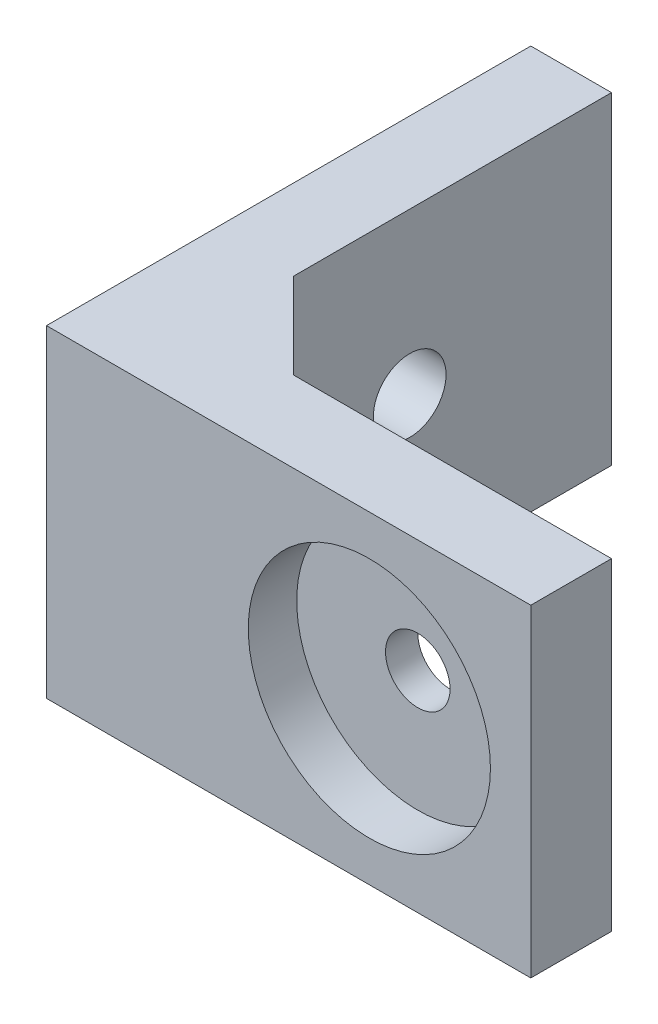
ISO-10303-21;
HEADER;
FILE_DESCRIPTION(('STEP AP214'),'2;1');
FILE_NAME('part.step','',(''),(''),'','','');
FILE_SCHEMA(('AUTOMOTIVE_DESIGN { 1 0 10303 214 1 1 1 1 }'));
ENDSEC;
DATA;
#1=APPLICATION_CONTEXT('core data for automotive mechanical design processes');
#2=APPLICATION_PROTOCOL_DEFINITION('international standard','automotive_design',2000,#1);
#3=PRODUCT_CONTEXT('',#1,'mechanical');
#4=PRODUCT('Part','Part','',(#3));
#5=PRODUCT_RELATED_PRODUCT_CATEGORY('part','',(#4));
#6=PRODUCT_DEFINITION_FORMATION('','',#4);
#7=PRODUCT_DEFINITION_CONTEXT('part definition',#1,'design');
#8=PRODUCT_DEFINITION('design','',#6,#7);
#9=PRODUCT_DEFINITION_SHAPE('','',#8);
#10=(LENGTH_UNIT() NAMED_UNIT(*) SI_UNIT(.MILLI.,.METRE.));
#11=(NAMED_UNIT(*) PLANE_ANGLE_UNIT() SI_UNIT($,.RADIAN.));
#12=(NAMED_UNIT(*) SI_UNIT($,.STERADIAN.) SOLID_ANGLE_UNIT());
#13=UNCERTAINTY_MEASURE_WITH_UNIT(LENGTH_MEASURE(1.E-05),#10,'distance_accuracy_value','');
#14=(GEOMETRIC_REPRESENTATION_CONTEXT(3) GLOBAL_UNCERTAINTY_ASSIGNED_CONTEXT((#13)) GLOBAL_UNIT_ASSIGNED_CONTEXT((#10,
#11,#12)) REPRESENTATION_CONTEXT('',''));
#15=CARTESIAN_POINT('',(0.,0.,0.));
#16=DIRECTION('',(0.,0.,1.));
#17=DIRECTION('',(1.,0.,0.));
#18=AXIS2_PLACEMENT_3D('',#15,#16,#17);
#19=CARTESIAN_POINT('',(0.,20.,-30.));
#20=DIRECTION('',(0.,0.,1.));
#21=DIRECTION('',(1.,0.,0.));
#22=AXIS2_PLACEMENT_3D('',#19,#20,#21);
#23=PLANE('',#22);
#24=DIRECTION('',(-1.,0.,0.));
#25=VECTOR('',#24,1.);
#26=CARTESIAN_POINT('',(0.,0.,-30.));
#27=LINE('',#26,#25);
#28=CARTESIAN_POINT('',(5.,0.,-30.));
#29=VERTEX_POINT('',#28);
#30=CARTESIAN_POINT('',(0.,0.,-30.));
#31=VERTEX_POINT('',#30);
#32=EDGE_CURVE('E128',#29,#31,#27,.T.);
#33=ORIENTED_EDGE('',*,*,#32,.T.);
#34=DIRECTION('',(0.,-1.,0.));
#35=VECTOR('',#34,1.);
#36=CARTESIAN_POINT('',(0.,20.,-30.));
#37=LINE('',#36,#35);
#38=CARTESIAN_POINT('',(0.,20.,-30.));
#39=VERTEX_POINT('',#38);
#40=EDGE_CURVE('E11',#39,#31,#37,.T.);
#41=ORIENTED_EDGE('',*,*,#40,.F.);
#42=DIRECTION('',(-1.,0.,0.));
#43=VECTOR('',#42,1.);
#44=CARTESIAN_POINT('',(0.,20.,-30.));
#45=LINE('',#44,#43);
#46=CARTESIAN_POINT('',(5.,20.,-30.));
#47=VERTEX_POINT('',#46);
#48=EDGE_CURVE('E141',#47,#39,#45,.T.);
#49=ORIENTED_EDGE('',*,*,#48,.F.);
#50=DIRECTION('',(0.,-1.,0.));
#51=VECTOR('',#50,1.);
#52=CARTESIAN_POINT('',(5.,20.,-30.));
#53=LINE('',#52,#51);
#54=EDGE_CURVE('E124',#47,#29,#53,.T.);
#55=ORIENTED_EDGE('',*,*,#54,.T.);
#56=EDGE_LOOP('',(#33,#41,#49,#55));
#57=FACE_BOUND('',#56,.T.);
#58=ADVANCED_FACE('F37',(#57),#23,.F.);
#59=CARTESIAN_POINT('',(0.,20.,0.));
#60=DIRECTION('',(1.,0.,0.));
#61=DIRECTION('',(0.,0.,-1.));
#62=AXIS2_PLACEMENT_3D('',#59,#60,#61);
#63=PLANE('',#62);
#64=CARTESIAN_POINT('',(0.,10.,-17.5));
#65=DIRECTION('',(1.,0.,0.));
#66=DIRECTION('',(0.,0.,-1.));
#67=AXIS2_PLACEMENT_3D('',#64,#65,#66);
#68=CIRCLE('',#67,2.24999999999999);
#69=CARTESIAN_POINT('',(0.,10.,-19.75));
#70=VERTEX_POINT('',#69);
#71=EDGE_CURVE('E132',#70,#70,#68,.T.);
#72=ORIENTED_EDGE('',*,*,#71,.T.);
#73=EDGE_LOOP('',(#72));
#74=FACE_BOUND('',#73,.T.);
#75=DIRECTION('',(0.,0.,1.));
#76=VECTOR('',#75,1.);
#77=CARTESIAN_POINT('',(0.,0.,0.));
#78=LINE('',#77,#76);
#79=CARTESIAN_POINT('',(0.,0.,0.));
#80=VERTEX_POINT('',#79);
#81=EDGE_CURVE('E131',#31,#80,#78,.T.);
#82=ORIENTED_EDGE('',*,*,#81,.T.);
#83=DIRECTION('',(0.,-1.,0.));
#84=VECTOR('',#83,1.);
#85=CARTESIAN_POINT('',(0.,20.,0.));
#86=LINE('',#85,#84);
#87=CARTESIAN_POINT('',(0.,20.,0.));
#88=VERTEX_POINT('',#87);
#89=EDGE_CURVE('E46',#88,#80,#86,.T.);
#90=ORIENTED_EDGE('',*,*,#89,.F.);
#91=DIRECTION('',(0.,0.,1.));
#92=VECTOR('',#91,1.);
#93=CARTESIAN_POINT('',(0.,20.,0.));
#94=LINE('',#93,#92);
#95=EDGE_CURVE('E94',#39,#88,#94,.T.);
#96=ORIENTED_EDGE('',*,*,#95,.F.);
#97=ORIENTED_EDGE('',*,*,#40,.T.);
#98=EDGE_LOOP('',(#82,#90,#96,#97));
#99=FACE_BOUND('',#98,.T.);
#100=ADVANCED_FACE('F200',(#74,#99),#63,.F.);
#101=CARTESIAN_POINT('',(30.,20.,0.));
#102=DIRECTION('',(0.,0.,-1.));
#103=DIRECTION('',(-1.,0.,0.));
#104=AXIS2_PLACEMENT_3D('',#101,#102,#103);
#105=PLANE('',#104);
#106=CARTESIAN_POINT('',(20.,10.,0.));
#107=DIRECTION('',(0.,0.,1.));
#108=DIRECTION('',(1.,0.,0.));
#109=AXIS2_PLACEMENT_3D('',#106,#107,#108);
#110=CIRCLE('',#109,7.5);
#111=CARTESIAN_POINT('',(27.5,10.,0.));
#112=VERTEX_POINT('',#111);
#113=EDGE_CURVE('E171',#112,#112,#110,.T.);
#114=ORIENTED_EDGE('',*,*,#113,.F.);
#115=EDGE_LOOP('',(#114));
#116=FACE_BOUND('',#115,.T.);
#117=DIRECTION('',(1.,0.,0.));
#118=VECTOR('',#117,1.);
#119=CARTESIAN_POINT('',(30.,0.,0.));
#120=LINE('',#119,#118);
#121=CARTESIAN_POINT('',(30.,0.,0.));
#122=VERTEX_POINT('',#121);
#123=EDGE_CURVE('E134',#80,#122,#120,.T.);
#124=ORIENTED_EDGE('',*,*,#123,.T.);
#125=DIRECTION('',(0.,-1.,0.));
#126=VECTOR('',#125,1.);
#127=CARTESIAN_POINT('',(30.,20.,0.));
#128=LINE('',#127,#126);
#129=CARTESIAN_POINT('',(30.,20.,0.));
#130=VERTEX_POINT('',#129);
#131=EDGE_CURVE('E145',#130,#122,#128,.T.);
#132=ORIENTED_EDGE('',*,*,#131,.F.);
#133=DIRECTION('',(1.,0.,0.));
#134=VECTOR('',#133,1.);
#135=CARTESIAN_POINT('',(30.,20.,0.));
#136=LINE('',#135,#134);
#137=EDGE_CURVE('E154',#88,#130,#136,.T.);
#138=ORIENTED_EDGE('',*,*,#137,.F.);
#139=ORIENTED_EDGE('',*,*,#89,.T.);
#140=EDGE_LOOP('',(#124,#132,#138,#139));
#141=FACE_BOUND('',#140,.T.);
#142=ADVANCED_FACE('F152',(#116,#141),#105,.F.);
#143=CARTESIAN_POINT('',(30.,20.,-5.));
#144=DIRECTION('',(-1.,0.,0.));
#145=DIRECTION('',(0.,0.,1.));
#146=AXIS2_PLACEMENT_3D('',#143,#144,#145);
#147=PLANE('',#146);
#148=DIRECTION('',(0.,0.,-1.));
#149=VECTOR('',#148,1.);
#150=CARTESIAN_POINT('',(30.,0.,-5.));
#151=LINE('',#150,#149);
#152=CARTESIAN_POINT('',(30.,0.,-5.));
#153=VERTEX_POINT('',#152);
#154=EDGE_CURVE('E136',#122,#153,#151,.T.);
#155=ORIENTED_EDGE('',*,*,#154,.T.);
#156=DIRECTION('',(0.,-1.,0.));
#157=VECTOR('',#156,1.);
#158=CARTESIAN_POINT('',(30.,20.,-5.));
#159=LINE('',#158,#157);
#160=CARTESIAN_POINT('',(30.,20.,-5.));
#161=VERTEX_POINT('',#160);
#162=EDGE_CURVE('E119',#161,#153,#159,.T.);
#163=ORIENTED_EDGE('',*,*,#162,.F.);
#164=DIRECTION('',(0.,0.,-1.));
#165=VECTOR('',#164,1.);
#166=CARTESIAN_POINT('',(30.,20.,-5.));
#167=LINE('',#166,#165);
#168=EDGE_CURVE('E110',#130,#161,#167,.T.);
#169=ORIENTED_EDGE('',*,*,#168,.F.);
#170=ORIENTED_EDGE('',*,*,#131,.T.);
#171=EDGE_LOOP('',(#155,#163,#169,#170));
#172=FACE_BOUND('',#171,.T.);
#173=ADVANCED_FACE('F160',(#172),#147,.F.);
#174=CARTESIAN_POINT('',(10.3033008588991,20.,-5.));
#175=DIRECTION('',(0.,0.,1.));
#176=DIRECTION('',(1.,0.,0.));
#177=AXIS2_PLACEMENT_3D('',#174,#175,#176);
#178=PLANE('',#177);
#179=CARTESIAN_POINT('',(20.,10.,-5.));
#180=DIRECTION('',(0.,0.,1.));
#181=DIRECTION('',(1.,0.,0.));
#182=AXIS2_PLACEMENT_3D('',#179,#180,#181);
#183=CIRCLE('',#182,2.);
#184=CARTESIAN_POINT('',(22.,10.,-5.));
#185=VERTEX_POINT('',#184);
#186=EDGE_CURVE('E174',#185,#185,#183,.T.);
#187=ORIENTED_EDGE('',*,*,#186,.T.);
#188=EDGE_LOOP('',(#187));
#189=FACE_BOUND('',#188,.T.);
#190=DIRECTION('',(-1.,0.,0.));
#191=VECTOR('',#190,1.);
#192=CARTESIAN_POINT('',(10.3033008588991,0.,-5.));
#193=LINE('',#192,#191);
#194=CARTESIAN_POINT('',(10.3033008588991,0.,-5.));
#195=VERTEX_POINT('',#194);
#196=EDGE_CURVE('E118',#153,#195,#193,.T.);
#197=ORIENTED_EDGE('',*,*,#196,.T.);
#198=DIRECTION('',(0.,-1.,0.));
#199=VECTOR('',#198,1.);
#200=CARTESIAN_POINT('',(10.3033008588991,20.,-5.));
#201=LINE('',#200,#199);
#202=CARTESIAN_POINT('',(10.3033008588991,20.,-5.));
#203=VERTEX_POINT('',#202);
#204=EDGE_CURVE('E115',#203,#195,#201,.T.);
#205=ORIENTED_EDGE('',*,*,#204,.F.);
#206=DIRECTION('',(-1.,0.,0.));
#207=VECTOR('',#206,1.);
#208=CARTESIAN_POINT('',(10.3033008588991,20.,-5.));
#209=LINE('',#208,#207);
#210=EDGE_CURVE('E104',#161,#203,#209,.T.);
#211=ORIENTED_EDGE('',*,*,#210,.F.);
#212=ORIENTED_EDGE('',*,*,#162,.T.);
#213=EDGE_LOOP('',(#197,#205,#211,#212));
#214=FACE_BOUND('',#213,.T.);
#215=ADVANCED_FACE('F116',(#189,#214),#178,.F.);
#216=CARTESIAN_POINT('',(5.,20.,-10.3033008588991));
#217=DIRECTION('',(-0.707106781186548,0.,0.707106781186548));
#218=DIRECTION('',(0.707106781186548,0.,0.707106781186548));
#219=AXIS2_PLACEMENT_3D('',#216,#217,#218);
#220=PLANE('',#219);
#221=DIRECTION('',(-0.707106781186548,0.,-0.707106781186548));
#222=VECTOR('',#221,1.);
#223=CARTESIAN_POINT('',(5.,0.,-10.3033008588991));
#224=LINE('',#223,#222);
#225=CARTESIAN_POINT('',(5.,0.,-10.3033008588991));
#226=VERTEX_POINT('',#225);
#227=EDGE_CURVE('E80',#195,#226,#224,.T.);
#228=ORIENTED_EDGE('',*,*,#227,.T.);
#229=DIRECTION('',(0.,-1.,0.));
#230=VECTOR('',#229,1.);
#231=CARTESIAN_POINT('',(5.,20.,-10.3033008588991));
#232=LINE('',#231,#230);
#233=CARTESIAN_POINT('',(5.,20.,-10.3033008588991));
#234=VERTEX_POINT('',#233);
#235=EDGE_CURVE('E120',#234,#226,#232,.T.);
#236=ORIENTED_EDGE('',*,*,#235,.F.);
#237=DIRECTION('',(-0.707106781186548,0.,-0.707106781186548));
#238=VECTOR('',#237,1.);
#239=CARTESIAN_POINT('',(5.,20.,-10.3033008588991));
#240=LINE('',#239,#238);
#241=EDGE_CURVE('E108',#203,#234,#240,.T.);
#242=ORIENTED_EDGE('',*,*,#241,.F.);
#243=ORIENTED_EDGE('',*,*,#204,.T.);
#244=EDGE_LOOP('',(#228,#236,#242,#243));
#245=FACE_BOUND('',#244,.T.);
#246=ADVANCED_FACE('F122',(#245),#220,.F.);
#247=CARTESIAN_POINT('',(5.,20.,-30.));
#248=DIRECTION('',(-1.,0.,0.));
#249=DIRECTION('',(0.,0.,1.));
#250=AXIS2_PLACEMENT_3D('',#247,#248,#249);
#251=PLANE('',#250);
#252=CARTESIAN_POINT('',(5.,10.,-17.5));
#253=DIRECTION('',(1.,0.,0.));
#254=DIRECTION('',(0.,0.,-1.));
#255=AXIS2_PLACEMENT_3D('',#252,#253,#254);
#256=CIRCLE('',#255,2.24999999999999);
#257=CARTESIAN_POINT('',(5.,10.,-19.75));
#258=VERTEX_POINT('',#257);
#259=EDGE_CURVE('E167',#258,#258,#256,.T.);
#260=ORIENTED_EDGE('',*,*,#259,.F.);
#261=EDGE_LOOP('',(#260));
#262=FACE_BOUND('',#261,.T.);
#263=DIRECTION('',(0.,0.,-1.));
#264=VECTOR('',#263,1.);
#265=CARTESIAN_POINT('',(5.,0.,-30.));
#266=LINE('',#265,#264);
#267=EDGE_CURVE('E86',#226,#29,#266,.T.);
#268=ORIENTED_EDGE('',*,*,#267,.T.);
#269=ORIENTED_EDGE('',*,*,#54,.F.);
#270=DIRECTION('',(0.,0.,-1.));
#271=VECTOR('',#270,1.);
#272=CARTESIAN_POINT('',(5.,20.,-30.));
#273=LINE('',#272,#271);
#274=EDGE_CURVE('E54',#234,#47,#273,.T.);
#275=ORIENTED_EDGE('',*,*,#274,.F.);
#276=ORIENTED_EDGE('',*,*,#235,.T.);
#277=EDGE_LOOP('',(#268,#269,#275,#276));
#278=FACE_BOUND('',#277,.T.);
#279=ADVANCED_FACE('F214',(#262,#278),#251,.F.);
#280=CARTESIAN_POINT('',(0.,20.,0.));
#281=DIRECTION('',(0.,-1.,0.));
#282=DIRECTION('',(0.,0.,-1.));
#283=AXIS2_PLACEMENT_3D('',#280,#281,#282);
#284=PLANE('',#283);
#285=ORIENTED_EDGE('',*,*,#48,.T.);
#286=ORIENTED_EDGE('',*,*,#95,.T.);
#287=ORIENTED_EDGE('',*,*,#137,.T.);
#288=ORIENTED_EDGE('',*,*,#168,.T.);
#289=ORIENTED_EDGE('',*,*,#210,.T.);
#290=ORIENTED_EDGE('',*,*,#241,.T.);
#291=ORIENTED_EDGE('',*,*,#274,.T.);
#292=EDGE_LOOP('',(#285,#286,#287,#288,#289,#290,#291));
#293=FACE_BOUND('',#292,.T.);
#294=ADVANCED_FACE('F106',(#293),#284,.F.);
#295=CARTESIAN_POINT('',(0.,0.,0.));
#296=DIRECTION('',(0.,-1.,0.));
#297=DIRECTION('',(0.,0.,-1.));
#298=AXIS2_PLACEMENT_3D('',#295,#296,#297);
#299=PLANE('',#298);
#300=ORIENTED_EDGE('',*,*,#32,.F.);
#301=ORIENTED_EDGE('',*,*,#267,.F.);
#302=ORIENTED_EDGE('',*,*,#227,.F.);
#303=ORIENTED_EDGE('',*,*,#196,.F.);
#304=ORIENTED_EDGE('',*,*,#154,.F.);
#305=ORIENTED_EDGE('',*,*,#123,.F.);
#306=ORIENTED_EDGE('',*,*,#81,.F.);
#307=EDGE_LOOP('',(#300,#301,#302,#303,#304,#305,#306));
#308=FACE_BOUND('',#307,.T.);
#309=ADVANCED_FACE('F158',(#308),#299,.T.);
#310=CARTESIAN_POINT('',(5.,10.,-17.5));
#311=DIRECTION('',(1.,0.,0.));
#312=DIRECTION('',(0.,0.,-1.));
#313=AXIS2_PLACEMENT_3D('',#310,#311,#312);
#314=CYLINDRICAL_SURFACE('',#313,2.24999999999999);
#315=ORIENTED_EDGE('',*,*,#259,.T.);
#316=EDGE_LOOP('',(#315));
#317=FACE_BOUND('',#316,.T.);
#318=ORIENTED_EDGE('',*,*,#71,.F.);
#319=EDGE_LOOP('',(#318));
#320=FACE_BOUND('',#319,.T.);
#321=ADVANCED_FACE('F195',(#317,#320),#314,.F.);
#322=CARTESIAN_POINT('',(20.,10.,-3.));
#323=DIRECTION('',(0.,0.,1.));
#324=DIRECTION('',(1.,0.,0.));
#325=AXIS2_PLACEMENT_3D('',#322,#323,#324);
#326=CYLINDRICAL_SURFACE('',#325,7.5);
#327=CARTESIAN_POINT('',(20.,10.,-3.));
#328=DIRECTION('',(0.,0.,1.));
#329=DIRECTION('',(1.,0.,0.));
#330=AXIS2_PLACEMENT_3D('',#327,#328,#329);
#331=CIRCLE('',#330,7.5);
#332=CARTESIAN_POINT('',(27.5,10.,-3.));
#333=VERTEX_POINT('',#332);
#334=EDGE_CURVE('E170',#333,#333,#331,.T.);
#335=ORIENTED_EDGE('',*,*,#334,.F.);
#336=EDGE_LOOP('',(#335));
#337=FACE_BOUND('',#336,.T.);
#338=ORIENTED_EDGE('',*,*,#113,.T.);
#339=EDGE_LOOP('',(#338));
#340=FACE_BOUND('',#339,.T.);
#341=ADVANCED_FACE('F189',(#337,#340),#326,.F.);
#342=CARTESIAN_POINT('',(20.,10.,-3.));
#343=DIRECTION('',(0.,0.,1.));
#344=DIRECTION('',(1.,0.,0.));
#345=AXIS2_PLACEMENT_3D('',#342,#343,#344);
#346=PLANE('',#345);
#347=CARTESIAN_POINT('',(20.,10.,-3.));
#348=DIRECTION('',(0.,0.,1.));
#349=DIRECTION('',(1.,0.,0.));
#350=AXIS2_PLACEMENT_3D('',#347,#348,#349);
#351=CIRCLE('',#350,2.);
#352=CARTESIAN_POINT('',(22.,10.,-3.));
#353=VERTEX_POINT('',#352);
#354=EDGE_CURVE('E40',#353,#353,#351,.T.);
#355=ORIENTED_EDGE('',*,*,#354,.F.);
#356=EDGE_LOOP('',(#355));
#357=FACE_BOUND('',#356,.T.);
#358=ORIENTED_EDGE('',*,*,#334,.T.);
#359=EDGE_LOOP('',(#358));
#360=FACE_BOUND('',#359,.T.);
#361=ADVANCED_FACE('F186',(#357,#360),#346,.T.);
#362=CARTESIAN_POINT('',(20.,10.,0.));
#363=DIRECTION('',(0.,0.,1.));
#364=DIRECTION('',(1.,0.,0.));
#365=AXIS2_PLACEMENT_3D('',#362,#363,#364);
#366=CYLINDRICAL_SURFACE('',#365,2.);
#367=ORIENTED_EDGE('',*,*,#354,.T.);
#368=EDGE_LOOP('',(#367));
#369=FACE_BOUND('',#368,.T.);
#370=ORIENTED_EDGE('',*,*,#186,.F.);
#371=EDGE_LOOP('',(#370));
#372=FACE_BOUND('',#371,.T.);
#373=ADVANCED_FACE('F183',(#369,#372),#366,.F.);
#374=CLOSED_SHELL('',(#58,#100,#142,#173,#215,#246,#279,#294,#309,#321,#341,#361,#373));
#375=MANIFOLD_SOLID_BREP('B2',#374);
#376=ADVANCED_BREP_SHAPE_REPRESENTATION('',(#18,#375),#14);
#377=SHAPE_DEFINITION_REPRESENTATION(#9,#376);
ENDSEC;
END-ISO-10303-21;
